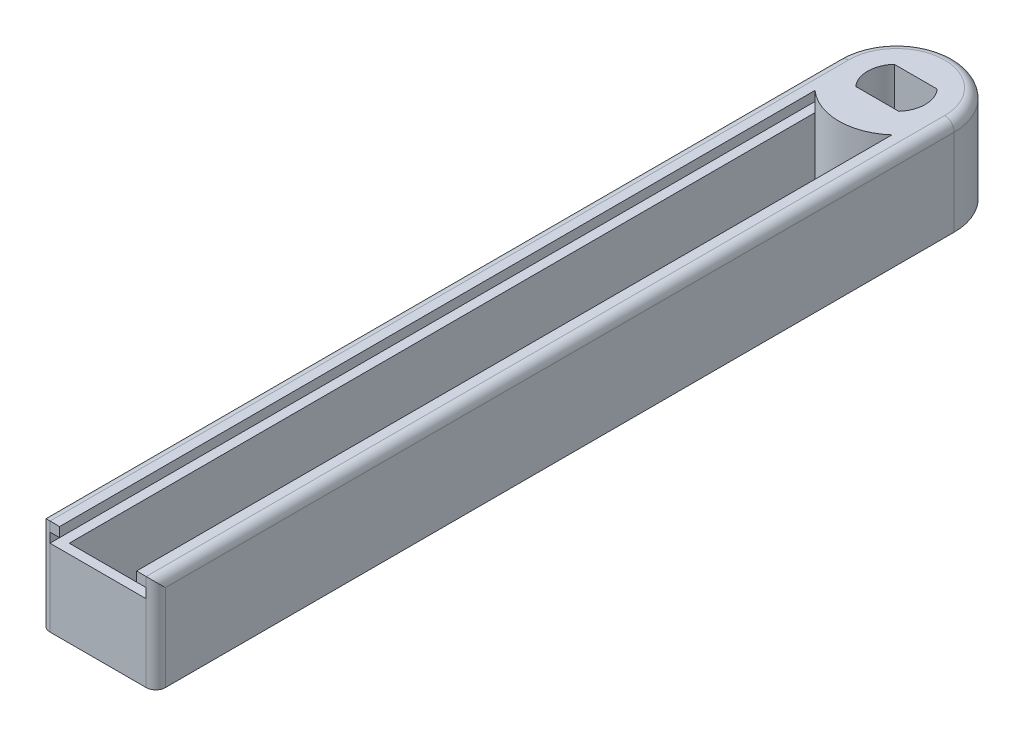
ISO-10303-21;
HEADER;
FILE_DESCRIPTION(('STEP AP214'),'2;1');
FILE_NAME('part.step','',(''),(''),'','','');
FILE_SCHEMA(('AUTOMOTIVE_DESIGN { 1 0 10303 214 1 1 1 1 }'));
ENDSEC;
DATA;
#1=APPLICATION_CONTEXT('core data for automotive mechanical design processes');
#2=APPLICATION_PROTOCOL_DEFINITION('international standard','automotive_design',2000,#1);
#3=PRODUCT_CONTEXT('',#1,'mechanical');
#4=PRODUCT('Part','Part','',(#3));
#5=PRODUCT_RELATED_PRODUCT_CATEGORY('part','',(#4));
#6=PRODUCT_DEFINITION_FORMATION('','',#4);
#7=PRODUCT_DEFINITION_CONTEXT('part definition',#1,'design');
#8=PRODUCT_DEFINITION('design','',#6,#7);
#9=PRODUCT_DEFINITION_SHAPE('','',#8);
#10=(LENGTH_UNIT() NAMED_UNIT(*) SI_UNIT(.MILLI.,.METRE.));
#11=(NAMED_UNIT(*) PLANE_ANGLE_UNIT() SI_UNIT($,.RADIAN.));
#12=(NAMED_UNIT(*) SI_UNIT($,.STERADIAN.) SOLID_ANGLE_UNIT());
#13=UNCERTAINTY_MEASURE_WITH_UNIT(LENGTH_MEASURE(1.E-05),#10,'distance_accuracy_value','');
#14=(GEOMETRIC_REPRESENTATION_CONTEXT(3) GLOBAL_UNCERTAINTY_ASSIGNED_CONTEXT((#13)) GLOBAL_UNIT_ASSIGNED_CONTEXT((#10,
#11,#12)) REPRESENTATION_CONTEXT('',''));
#15=CARTESIAN_POINT('',(0.,0.,0.));
#16=DIRECTION('',(0.,0.,1.));
#17=DIRECTION('',(1.,0.,0.));
#18=AXIS2_PLACEMENT_3D('',#15,#16,#17);
#19=CARTESIAN_POINT('',(0.,2.5,0.));
#20=DIRECTION('',(0.,-1.,0.));
#21=DIRECTION('',(0.,0.,-1.));
#22=AXIS2_PLACEMENT_3D('',#19,#20,#21);
#23=PLANE('',#22);
#24=CARTESIAN_POINT('',(-3.38181818181818,2.5,-6.94545454545455));
#25=DIRECTION('',(0.,-1.,0.));
#26=DIRECTION('',(0.,0.,-1.));
#27=AXIS2_PLACEMENT_3D('',#24,#25,#26);
#28=CIRCLE('',#27,3.);
#29=CARTESIAN_POINT('',(-5.61788615931797,2.5,-8.94545454545455));
#30=VERTEX_POINT('',#29);
#31=CARTESIAN_POINT('',(-1.14575020431839,2.5,-8.94545454545455));
#32=VERTEX_POINT('',#31);
#33=EDGE_CURVE('E246',#30,#32,#28,.T.);
#34=ORIENTED_EDGE('',*,*,#33,.T.);
#35=DIRECTION('',(1.,0.,0.));
#36=VECTOR('',#35,1.);
#37=CARTESIAN_POINT('',(0.,2.5,-8.94545454545455));
#38=LINE('',#37,#36);
#39=EDGE_CURVE('E238',#30,#32,#38,.T.);
#40=ORIENTED_EDGE('',*,*,#39,.F.);
#41=EDGE_LOOP('',(#34,#40));
#42=FACE_BOUND('',#41,.T.);
#43=ADVANCED_FACE('F44',(#42),#23,.T.);
#44=CARTESIAN_POINT('',(-3.38181818181818,10.,-6.94545454545455));
#45=DIRECTION('',(0.,-1.,0.));
#46=DIRECTION('',(0.,0.,-1.));
#47=AXIS2_PLACEMENT_3D('',#44,#45,#46);
#48=CYLINDRICAL_SURFACE('',#47,6.);
#49=DIRECTION('',(0.,1.,0.));
#50=VECTOR('',#49,1.);
#51=CARTESIAN_POINT('',(0.618181818181691,0.,-2.47331859045486));
#52=LINE('',#51,#50);
#53=CARTESIAN_POINT('',(0.618181818181691,0.,-2.47331859045486));
#54=VERTEX_POINT('',#53);
#55=CARTESIAN_POINT('',(0.618181818181828,8.,-2.47331859045498));
#56=VERTEX_POINT('',#55);
#57=EDGE_CURVE('E270',#54,#56,#52,.T.);
#58=ORIENTED_EDGE('',*,*,#57,.T.);
#59=CARTESIAN_POINT('',(-3.38181818181818,8.,-6.94545454545455));
#60=DIRECTION('',(0.,1.,0.));
#61=DIRECTION('',(0.,0.,1.));
#62=AXIS2_PLACEMENT_3D('',#59,#60,#61);
#63=CIRCLE('',#62,6.);
#64=CARTESIAN_POINT('',(1.49157899058629,8.,-3.44545454545454));
#65=VERTEX_POINT('',#64);
#66=EDGE_CURVE('E332',#56,#65,#63,.T.);
#67=ORIENTED_EDGE('',*,*,#66,.T.);
#68=DIRECTION('',(0.,-1.,0.));
#69=VECTOR('',#68,1.);
#70=CARTESIAN_POINT('',(1.49157899058629,10.,-3.44545454545454));
#71=LINE('',#70,#69);
#72=CARTESIAN_POINT('',(1.49157899058629,0.,-3.44545454545454));
#73=VERTEX_POINT('',#72);
#74=EDGE_CURVE('E463',#73,#65,#71,.F.);
#75=ORIENTED_EDGE('',*,*,#74,.F.);
#76=CARTESIAN_POINT('',(-3.38181818181818,0.,-6.94545454545455));
#77=DIRECTION('',(0.,1.,0.));
#78=DIRECTION('',(0.,0.,1.));
#79=AXIS2_PLACEMENT_3D('',#76,#77,#78);
#80=CIRCLE('',#79,6.);
#81=CARTESIAN_POINT('',(1.61818181818181,0.,-3.62882975509914));
#82=VERTEX_POINT('',#81);
#83=EDGE_CURVE('E391',#73,#82,#80,.T.);
#84=ORIENTED_EDGE('',*,*,#83,.T.);
#85=DIRECTION('',(0.,-1.,0.));
#86=VECTOR('',#85,1.);
#87=CARTESIAN_POINT('',(1.61818181818181,10.,-3.62882975509914));
#88=LINE('',#87,#86);
#89=CARTESIAN_POINT('',(1.61818181818183,9.,-3.62882975509914));
#90=VERTEX_POINT('',#89);
#91=EDGE_CURVE('E382',#90,#82,#88,.T.);
#92=ORIENTED_EDGE('',*,*,#91,.F.);
#93=CARTESIAN_POINT('',(-3.38181818181818,9.,-6.94545454545455));
#94=DIRECTION('',(0.,-1.,0.));
#95=DIRECTION('',(0.,0.,-1.));
#96=AXIS2_PLACEMENT_3D('',#93,#94,#95);
#97=CIRCLE('',#96,6.);
#98=CARTESIAN_POINT('',(0.618181818181824,9.,-2.47331859045498));
#99=VERTEX_POINT('',#98);
#100=EDGE_CURVE('E410',#90,#99,#97,.T.);
#101=ORIENTED_EDGE('',*,*,#100,.T.);
#102=DIRECTION('',(0.,1.,0.));
#103=VECTOR('',#102,1.);
#104=CARTESIAN_POINT('',(0.618181818181822,6.99999999999998,-2.47331859045498));
#105=LINE('',#104,#103);
#106=CARTESIAN_POINT('',(0.618181818181828,10.,-2.47331859045498));
#107=VERTEX_POINT('',#106);
#108=EDGE_CURVE('E296',#99,#107,#105,.T.);
#109=ORIENTED_EDGE('',*,*,#108,.T.);
#110=CARTESIAN_POINT('',(-3.38181818181818,10.,-6.94545454545455));
#111=DIRECTION('',(0.,1.,0.));
#112=DIRECTION('',(0.,0.,1.));
#113=AXIS2_PLACEMENT_3D('',#110,#111,#112);
#114=CIRCLE('',#113,6.);
#115=CARTESIAN_POINT('',(-7.38181818181817,10.,-2.47331859045496));
#116=VERTEX_POINT('',#115);
#117=EDGE_CURVE('E347',#116,#107,#114,.T.);
#118=ORIENTED_EDGE('',*,*,#117,.F.);
#119=DIRECTION('',(0.,1.,0.));
#120=VECTOR('',#119,1.);
#121=CARTESIAN_POINT('',(-7.38181818181817,6.99999999999999,-2.47331859045496));
#122=LINE('',#121,#120);
#123=CARTESIAN_POINT('',(-7.38181818181817,9.,-2.47331859045496));
#124=VERTEX_POINT('',#123);
#125=EDGE_CURVE('E292',#124,#116,#122,.T.);
#126=ORIENTED_EDGE('',*,*,#125,.F.);
#127=CARTESIAN_POINT('',(-3.38181818181818,9.,-6.94545454545455));
#128=DIRECTION('',(0.,-1.,0.));
#129=DIRECTION('',(0.,0.,-1.));
#130=AXIS2_PLACEMENT_3D('',#127,#128,#129);
#131=CIRCLE('',#130,6.);
#132=CARTESIAN_POINT('',(-8.38181818181817,9.,-3.62882975509914));
#133=VERTEX_POINT('',#132);
#134=EDGE_CURVE('E392',#124,#133,#131,.T.);
#135=ORIENTED_EDGE('',*,*,#134,.T.);
#136=DIRECTION('',(0.,-1.,0.));
#137=VECTOR('',#136,1.);
#138=CARTESIAN_POINT('',(-8.38181818181817,10.,-3.62882975509914));
#139=LINE('',#138,#137);
#140=CARTESIAN_POINT('',(-8.38181818181817,0.,-3.62882975509914));
#141=VERTEX_POINT('',#140);
#142=EDGE_CURVE('E387',#133,#141,#139,.T.);
#143=ORIENTED_EDGE('',*,*,#142,.T.);
#144=CARTESIAN_POINT('',(-8.25521535422266,0.,-3.44545454545454));
#145=VERTEX_POINT('',#144);
#146=EDGE_CURVE('E406',#141,#145,#80,.T.);
#147=ORIENTED_EDGE('',*,*,#146,.T.);
#148=DIRECTION('',(0.,-1.,0.));
#149=VECTOR('',#148,1.);
#150=CARTESIAN_POINT('',(-8.25521535422266,10.,-3.44545454545454));
#151=LINE('',#150,#149);
#152=CARTESIAN_POINT('',(-8.25521535422266,8.,-3.44545454545454));
#153=VERTEX_POINT('',#152);
#154=EDGE_CURVE('E430',#153,#145,#151,.T.);
#155=ORIENTED_EDGE('',*,*,#154,.F.);
#156=CARTESIAN_POINT('',(-3.38181818181818,8.,-6.94545454545455));
#157=DIRECTION('',(0.,1.,0.));
#158=DIRECTION('',(0.,0.,1.));
#159=AXIS2_PLACEMENT_3D('',#156,#157,#158);
#160=CIRCLE('',#159,6.);
#161=CARTESIAN_POINT('',(-7.38181818181817,8.,-2.47331859045496));
#162=VERTEX_POINT('',#161);
#163=EDGE_CURVE('E457',#153,#162,#160,.T.);
#164=ORIENTED_EDGE('',*,*,#163,.T.);
#165=DIRECTION('',(0.,1.,0.));
#166=VECTOR('',#165,1.);
#167=CARTESIAN_POINT('',(-7.38181818181817,0.,-2.47331859045496));
#168=LINE('',#167,#166);
#169=CARTESIAN_POINT('',(-7.38181818181817,0.,-2.47331859045496));
#170=VERTEX_POINT('',#169);
#171=EDGE_CURVE('E285',#170,#162,#168,.T.);
#172=ORIENTED_EDGE('',*,*,#171,.F.);
#173=EDGE_CURVE('E411',#170,#54,#80,.T.);
#174=ORIENTED_EDGE('',*,*,#173,.T.);
#175=EDGE_LOOP('',(#58,#67,#75,#84,#92,#101,#109,#118,#126,#135,#143,#147,#155,#164,#172,#174));
#176=FACE_BOUND('',#175,.T.);
#177=ADVANCED_FACE('F570',(#176),#48,.T.);
#178=CARTESIAN_POINT('',(0.,10.,75.0545454545455));
#179=DIRECTION('',(0.,0.,-1.));
#180=DIRECTION('',(-1.,0.,0.));
#181=AXIS2_PLACEMENT_3D('',#178,#179,#180);
#182=PLANE('',#181);
#183=DIRECTION('',(1.,0.,0.));
#184=VECTOR('',#183,1.);
#185=CARTESIAN_POINT('',(0.,8.,75.0545454545455));
#186=LINE('',#185,#184);
#187=CARTESIAN_POINT('',(-7.38181818181817,8.,75.0545454545455));
#188=VERTEX_POINT('',#187);
#189=CARTESIAN_POINT('',(0.618181818181827,8.,75.0545454545455));
#190=VERTEX_POINT('',#189);
#191=EDGE_CURVE('E386',#188,#190,#186,.T.);
#192=ORIENTED_EDGE('',*,*,#191,.T.);
#193=DIRECTION('',(0.,-1.,0.));
#194=VECTOR('',#193,1.);
#195=CARTESIAN_POINT('',(0.618181818181826,10.,75.0545454545455));
#196=LINE('',#195,#194);
#197=CARTESIAN_POINT('',(0.618181818181826,0.,75.0545454545455));
#198=VERTEX_POINT('',#197);
#199=EDGE_CURVE('E273',#190,#198,#196,.T.);
#200=ORIENTED_EDGE('',*,*,#199,.T.);
#201=DIRECTION('',(1.,0.,0.));
#202=VECTOR('',#201,1.);
#203=CARTESIAN_POINT('',(0.,0.,75.0545454545455));
#204=LINE('',#203,#202);
#205=CARTESIAN_POINT('',(-7.38181818181817,0.,75.0545454545455));
#206=VERTEX_POINT('',#205);
#207=EDGE_CURVE('E328',#206,#198,#204,.T.);
#208=ORIENTED_EDGE('',*,*,#207,.F.);
#209=DIRECTION('',(0.,-1.,0.));
#210=VECTOR('',#209,1.);
#211=CARTESIAN_POINT('',(-7.38181818181817,10.,75.0545454545455));
#212=LINE('',#211,#210);
#213=EDGE_CURVE('E288',#188,#206,#212,.T.);
#214=ORIENTED_EDGE('',*,*,#213,.F.);
#215=EDGE_LOOP('',(#192,#200,#208,#214));
#216=FACE_BOUND('',#215,.T.);
#217=ADVANCED_FACE('F580',(#216),#182,.T.);
#218=CARTESIAN_POINT('',(0.,10.,76.0545454545455));
#219=DIRECTION('',(0.,0.,-1.));
#220=DIRECTION('',(-1.,0.,0.));
#221=AXIS2_PLACEMENT_3D('',#218,#219,#220);
#222=PLANE('',#221);
#223=DIRECTION('',(0.,-1.,0.));
#224=VECTOR('',#223,1.);
#225=CARTESIAN_POINT('',(0.61818181818181,0.,76.0545454545455));
#226=LINE('',#225,#224);
#227=CARTESIAN_POINT('',(0.618181818181828,10.,76.0545454545455));
#228=VERTEX_POINT('',#227);
#229=CARTESIAN_POINT('',(0.618181818181826,9.,76.0545454545455));
#230=VERTEX_POINT('',#229);
#231=EDGE_CURVE('E300',#228,#230,#226,.T.);
#232=ORIENTED_EDGE('',*,*,#231,.T.);
#233=DIRECTION('',(1.,0.,0.));
#234=VECTOR('',#233,1.);
#235=CARTESIAN_POINT('',(0.,9.,76.0545454545455));
#236=LINE('',#235,#234);
#237=CARTESIAN_POINT('',(1.61818181818183,9.,76.0545454545455));
#238=VERTEX_POINT('',#237);
#239=EDGE_CURVE('E348',#230,#238,#236,.T.);
#240=ORIENTED_EDGE('',*,*,#239,.T.);
#241=DIRECTION('',(0.,-1.,0.));
#242=VECTOR('',#241,1.);
#243=CARTESIAN_POINT('',(1.61818181818183,10.,76.0545454545455));
#244=LINE('',#243,#242);
#245=CARTESIAN_POINT('',(1.61818181818183,10.,76.0545454545455));
#246=VERTEX_POINT('',#245);
#247=EDGE_CURVE('E343',#238,#246,#244,.F.);
#248=ORIENTED_EDGE('',*,*,#247,.T.);
#249=DIRECTION('',(1.,0.,0.));
#250=VECTOR('',#249,1.);
#251=CARTESIAN_POINT('',(0.,10.,76.0545454545455));
#252=LINE('',#251,#250);
#253=EDGE_CURVE('E370',#228,#246,#252,.T.);
#254=ORIENTED_EDGE('',*,*,#253,.F.);
#255=EDGE_LOOP('',(#232,#240,#248,#254));
#256=FACE_BOUND('',#255,.T.);
#257=ADVANCED_FACE('F508',(#256),#222,.F.);
#258=CARTESIAN_POINT('',(0.,10.,0.));
#259=DIRECTION('',(0.,1.,0.));
#260=DIRECTION('',(0.,0.,1.));
#261=AXIS2_PLACEMENT_3D('',#258,#259,#260);
#262=PLANE('',#261);
#263=DIRECTION('',(1.,0.,0.));
#264=VECTOR('',#263,1.);
#265=CARTESIAN_POINT('',(0.,10.,-4.94545454545455));
#266=LINE('',#265,#264);
#267=CARTESIAN_POINT('',(-5.61788615931797,10.,-4.94545454545455));
#268=VERTEX_POINT('',#267);
#269=CARTESIAN_POINT('',(-1.14575020431839,10.,-4.94545454545455));
#270=VERTEX_POINT('',#269);
#271=EDGE_CURVE('E62',#268,#270,#266,.T.);
#272=ORIENTED_EDGE('',*,*,#271,.F.);
#273=CARTESIAN_POINT('',(-3.38181818181818,10.,-6.94545454545455));
#274=DIRECTION('',(0.,1.,0.));
#275=DIRECTION('',(0.,0.,1.));
#276=AXIS2_PLACEMENT_3D('',#273,#274,#275);
#277=CIRCLE('',#276,3.);
#278=CARTESIAN_POINT('',(-5.61788615931797,10.,-8.94545454545455));
#279=VERTEX_POINT('',#278);
#280=EDGE_CURVE('E231',#279,#268,#277,.T.);
#281=ORIENTED_EDGE('',*,*,#280,.F.);
#282=DIRECTION('',(1.,0.,0.));
#283=VECTOR('',#282,1.);
#284=CARTESIAN_POINT('',(0.,10.,-8.94545454545455));
#285=LINE('',#284,#283);
#286=CARTESIAN_POINT('',(-1.14575020431839,10.,-8.94545454545455));
#287=VERTEX_POINT('',#286);
#288=EDGE_CURVE('E1151',#279,#287,#285,.T.);
#289=ORIENTED_EDGE('',*,*,#288,.T.);
#290=EDGE_CURVE('E1153',#270,#287,#277,.T.);
#291=ORIENTED_EDGE('',*,*,#290,.F.);
#292=EDGE_LOOP('',(#272,#281,#289,#291));
#293=FACE_BOUND('',#292,.T.);
#294=ORIENTED_EDGE('',*,*,#117,.T.);
#295=DIRECTION('',(0.,0.,1.));
#296=VECTOR('',#295,1.);
#297=CARTESIAN_POINT('',(0.618181818181828,10.,-2.94545454545456));
#298=LINE('',#297,#296);
#299=EDGE_CURVE('E425',#107,#228,#298,.T.);
#300=ORIENTED_EDGE('',*,*,#299,.T.);
#301=ORIENTED_EDGE('',*,*,#253,.T.);
#302=DIRECTION('',(0.,0.,1.));
#303=VECTOR('',#302,1.);
#304=CARTESIAN_POINT('',(1.61818181818182,10.,0.));
#305=LINE('',#304,#303);
#306=CARTESIAN_POINT('',(1.61818181818182,10.,-6.94545454545455));
#307=VERTEX_POINT('',#306);
#308=EDGE_CURVE('E366',#246,#307,#305,.F.);
#309=ORIENTED_EDGE('',*,*,#308,.T.);
#310=CARTESIAN_POINT('',(-3.38181818181818,10.,-6.94545454545455));
#311=DIRECTION('',(0.,1.,0.));
#312=DIRECTION('',(0.,0.,1.));
#313=AXIS2_PLACEMENT_3D('',#310,#311,#312);
#314=CIRCLE('',#313,5.);
#315=CARTESIAN_POINT('',(-8.38181818181818,10.,-6.94545454545455));
#316=VERTEX_POINT('',#315);
#317=EDGE_CURVE('E369',#307,#316,#314,.T.);
#318=ORIENTED_EDGE('',*,*,#317,.T.);
#319=DIRECTION('',(0.,0.,1.));
#320=VECTOR('',#319,1.);
#321=CARTESIAN_POINT('',(-8.38181818181817,10.,76.0545454545455));
#322=LINE('',#321,#320);
#323=CARTESIAN_POINT('',(-8.38181818181817,10.,76.0545454545455));
#324=VERTEX_POINT('',#323);
#325=EDGE_CURVE('E371',#316,#324,#322,.T.);
#326=ORIENTED_EDGE('',*,*,#325,.T.);
#327=CARTESIAN_POINT('',(-7.38181818181817,10.,76.0545454545455));
#328=VERTEX_POINT('',#327);
#329=EDGE_CURVE('E374',#324,#328,#252,.T.);
#330=ORIENTED_EDGE('',*,*,#329,.T.);
#331=DIRECTION('',(0.,0.,1.));
#332=VECTOR('',#331,1.);
#333=CARTESIAN_POINT('',(-7.38181818181817,10.,-2.94545454545456));
#334=LINE('',#333,#332);
#335=EDGE_CURVE('E11',#116,#328,#334,.T.);
#336=ORIENTED_EDGE('',*,*,#335,.F.);
#337=EDGE_LOOP('',(#294,#300,#301,#309,#318,#326,#330,#336));
#338=FACE_BOUND('',#337,.T.);
#339=ADVANCED_FACE('F500',(#293,#338),#262,.T.);
#340=CARTESIAN_POINT('',(0.,9.,-12.9464545454546));
#341=DIRECTION('',(0.,-1.,0.));
#342=DIRECTION('',(0.,0.,-1.));
#343=AXIS2_PLACEMENT_3D('',#340,#341,#342);
#344=PLANE('',#343);
#345=ORIENTED_EDGE('',*,*,#239,.F.);
#346=DIRECTION('',(0.,0.,1.));
#347=VECTOR('',#346,1.);
#348=CARTESIAN_POINT('',(0.618181818181826,9.,-2.94545454545456));
#349=LINE('',#348,#347);
#350=EDGE_CURVE('E318',#99,#230,#349,.T.);
#351=ORIENTED_EDGE('',*,*,#350,.F.);
#352=ORIENTED_EDGE('',*,*,#100,.F.);
#353=DIRECTION('',(0.,0.,1.));
#354=VECTOR('',#353,1.);
#355=CARTESIAN_POINT('',(1.61818181818183,9.,-12.9464545454546));
#356=LINE('',#355,#354);
#357=EDGE_CURVE('E435',#90,#238,#356,.T.);
#358=ORIENTED_EDGE('',*,*,#357,.T.);
#359=EDGE_LOOP('',(#345,#351,#352,#358));
#360=FACE_BOUND('',#359,.T.);
#361=ADVANCED_FACE('F612',(#360),#344,.T.);
#362=CARTESIAN_POINT('',(-8.38181818181817,9.,76.0545454545455));
#363=VERTEX_POINT('',#362);
#364=CARTESIAN_POINT('',(-7.38181818181817,9.,76.0545454545455));
#365=VERTEX_POINT('',#364);
#366=EDGE_CURVE('E48',#363,#365,#236,.T.);
#367=ORIENTED_EDGE('',*,*,#366,.T.);
#368=DIRECTION('',(0.,-1.,0.));
#369=VECTOR('',#368,1.);
#370=CARTESIAN_POINT('',(-7.38181818181817,0.,76.0545454545455));
#371=LINE('',#370,#369);
#372=EDGE_CURVE('E54',#328,#365,#371,.T.);
#373=ORIENTED_EDGE('',*,*,#372,.F.);
#374=ORIENTED_EDGE('',*,*,#329,.F.);
#375=DIRECTION('',(0.,-1.,0.));
#376=VECTOR('',#375,1.);
#377=CARTESIAN_POINT('',(-8.38181818181817,10.,76.0545454545455));
#378=LINE('',#377,#376);
#379=EDGE_CURVE('E329',#324,#363,#378,.T.);
#380=ORIENTED_EDGE('',*,*,#379,.T.);
#381=EDGE_LOOP('',(#367,#373,#374,#380));
#382=FACE_BOUND('',#381,.T.);
#383=ADVANCED_FACE('F528',(#382),#222,.F.);
#384=CARTESIAN_POINT('',(1.61818181818181,10.,0.));
#385=DIRECTION('',(-1.,0.,0.));
#386=DIRECTION('',(0.,0.,1.));
#387=AXIS2_PLACEMENT_3D('',#384,#385,#386);
#388=PLANE('',#387);
#389=DIRECTION('',(0.,0.,-1.));
#390=VECTOR('',#389,1.);
#391=CARTESIAN_POINT('',(1.61818181818181,0.,0.));
#392=LINE('',#391,#390);
#393=CARTESIAN_POINT('',(1.61818181818181,0.,-3.44545454545454));
#394=VERTEX_POINT('',#393);
#395=EDGE_CURVE('E401',#394,#82,#392,.T.);
#396=ORIENTED_EDGE('',*,*,#395,.F.);
#397=DIRECTION('',(0.,-1.,0.));
#398=VECTOR('',#397,1.);
#399=CARTESIAN_POINT('',(1.61818181818183,0.,-3.44545454545454));
#400=LINE('',#399,#398);
#401=CARTESIAN_POINT('',(1.61818181818181,8.,-3.44545454545454));
#402=VERTEX_POINT('',#401);
#403=EDGE_CURVE('E451',#402,#394,#400,.T.);
#404=ORIENTED_EDGE('',*,*,#403,.F.);
#405=DIRECTION('',(0.,0.,1.));
#406=VECTOR('',#405,1.);
#407=CARTESIAN_POINT('',(1.61818181818183,8.,-12.9464545454546));
#408=LINE('',#407,#406);
#409=CARTESIAN_POINT('',(1.61818181818183,8.,76.0545454545455));
#410=VERTEX_POINT('',#409);
#411=EDGE_CURVE('E337',#402,#410,#408,.T.);
#412=ORIENTED_EDGE('',*,*,#411,.T.);
#413=DIRECTION('',(0.,-1.,0.));
#414=VECTOR('',#413,1.);
#415=CARTESIAN_POINT('',(1.61818181818183,0.,76.0545454545455));
#416=LINE('',#415,#414);
#417=EDGE_CURVE('E306',#238,#410,#416,.T.);
#418=ORIENTED_EDGE('',*,*,#417,.F.);
#419=ORIENTED_EDGE('',*,*,#357,.F.);
#420=ORIENTED_EDGE('',*,*,#91,.T.);
#421=EDGE_LOOP('',(#396,#404,#412,#418,#419,#420));
#422=FACE_BOUND('',#421,.T.);
#423=ADVANCED_FACE('F558',(#422),#388,.T.);
#424=DIRECTION('',(0.,-1.,0.));
#425=VECTOR('',#424,1.);
#426=CARTESIAN_POINT('',(1.61818181818183,10.,76.0545454545455));
#427=LINE('',#426,#425);
#428=CARTESIAN_POINT('',(1.61818181818183,0.,76.0545454545455));
#429=VERTEX_POINT('',#428);
#430=EDGE_CURVE('E338',#429,#410,#427,.F.);
#431=ORIENTED_EDGE('',*,*,#430,.T.);
#432=DIRECTION('',(1.,0.,0.));
#433=VECTOR('',#432,1.);
#434=CARTESIAN_POINT('',(0.,8.,76.0545454545455));
#435=LINE('',#434,#433);
#436=CARTESIAN_POINT('',(-8.38181818181817,8.,76.0545454545455));
#437=VERTEX_POINT('',#436);
#438=EDGE_CURVE('E444',#437,#410,#435,.T.);
#439=ORIENTED_EDGE('',*,*,#438,.F.);
#440=DIRECTION('',(0.,-1.,0.));
#441=VECTOR('',#440,1.);
#442=CARTESIAN_POINT('',(-8.38181818181817,10.,76.0545454545455));
#443=LINE('',#442,#441);
#444=CARTESIAN_POINT('',(-8.38181818181817,0.,76.0545454545455));
#445=VERTEX_POINT('',#444);
#446=EDGE_CURVE('E333',#437,#445,#443,.T.);
#447=ORIENTED_EDGE('',*,*,#446,.T.);
#448=DIRECTION('',(1.,0.,0.));
#449=VECTOR('',#448,1.);
#450=CARTESIAN_POINT('',(0.,0.,76.0545454545455));
#451=LINE('',#450,#449);
#452=EDGE_CURVE('E336',#445,#429,#451,.T.);
#453=ORIENTED_EDGE('',*,*,#452,.T.);
#454=EDGE_LOOP('',(#431,#439,#447,#453));
#455=FACE_BOUND('',#454,.T.);
#456=ADVANCED_FACE('F46',(#455),#222,.F.);
#457=CARTESIAN_POINT('',(2.61818181818182,10.,0.));
#458=DIRECTION('',(1.,0.,0.));
#459=DIRECTION('',(0.,0.,-1.));
#460=AXIS2_PLACEMENT_3D('',#457,#458,#459);
#461=PLANE('',#460);
#462=DIRECTION('',(0.,-1.,0.));
#463=VECTOR('',#462,1.);
#464=CARTESIAN_POINT('',(2.61818181818182,10.,-6.94545454545455));
#465=LINE('',#464,#463);
#466=CARTESIAN_POINT('',(2.61818181818182,9.,-6.94545454545455));
#467=VERTEX_POINT('',#466);
#468=CARTESIAN_POINT('',(2.61818181818182,0.,-6.94545454545455));
#469=VERTEX_POINT('',#468);
#470=EDGE_CURVE('E357',#467,#469,#465,.T.);
#471=ORIENTED_EDGE('',*,*,#470,.F.);
#472=DIRECTION('',(0.,0.,1.));
#473=VECTOR('',#472,1.);
#474=CARTESIAN_POINT('',(2.61818181818182,9.,0.));
#475=LINE('',#474,#473);
#476=CARTESIAN_POINT('',(2.61818181818183,9.,75.0545454545455));
#477=VERTEX_POINT('',#476);
#478=EDGE_CURVE('E342',#467,#477,#475,.T.);
#479=ORIENTED_EDGE('',*,*,#478,.T.);
#480=DIRECTION('',(0.,-1.,0.));
#481=VECTOR('',#480,1.);
#482=CARTESIAN_POINT('',(2.61818181818183,0.,75.0545454545455));
#483=LINE('',#482,#481);
#484=CARTESIAN_POINT('',(2.61818181818183,0.,75.0545454545455));
#485=VERTEX_POINT('',#484);
#486=EDGE_CURVE('E351',#477,#485,#483,.T.);
#487=ORIENTED_EDGE('',*,*,#486,.T.);
#488=DIRECTION('',(0.,0.,1.));
#489=VECTOR('',#488,1.);
#490=CARTESIAN_POINT('',(2.61818181818182,0.,0.));
#491=LINE('',#490,#489);
#492=EDGE_CURVE('E322',#469,#485,#491,.T.);
#493=ORIENTED_EDGE('',*,*,#492,.F.);
#494=EDGE_LOOP('',(#471,#479,#487,#493));
#495=FACE_BOUND('',#494,.T.);
#496=ADVANCED_FACE('F655',(#495),#461,.T.);
#497=CARTESIAN_POINT('',(-3.38181818181818,10.,-6.94545454545455));
#498=DIRECTION('',(0.,-1.,0.));
#499=DIRECTION('',(0.,0.,-1.));
#500=AXIS2_PLACEMENT_3D('',#497,#498,#499);
#501=CYLINDRICAL_SURFACE('',#500,6.);
#502=DIRECTION('',(0.,-1.,0.));
#503=VECTOR('',#502,1.);
#504=CARTESIAN_POINT('',(-9.38181818181818,10.,-6.94545454545455));
#505=LINE('',#504,#503);
#506=CARTESIAN_POINT('',(-9.38181818181818,9.,-6.94545454545455));
#507=VERTEX_POINT('',#506);
#508=CARTESIAN_POINT('',(-9.38181818181818,0.,-6.94545454545455));
#509=VERTEX_POINT('',#508);
#510=EDGE_CURVE('E361',#507,#509,#505,.T.);
#511=ORIENTED_EDGE('',*,*,#510,.F.);
#512=CARTESIAN_POINT('',(-3.38181818181818,9.,-6.94545454545455));
#513=DIRECTION('',(0.,1.,0.));
#514=DIRECTION('',(0.,0.,1.));
#515=AXIS2_PLACEMENT_3D('',#512,#513,#514);
#516=CIRCLE('',#515,6.);
#517=EDGE_CURVE('E354',#507,#467,#516,.F.);
#518=ORIENTED_EDGE('',*,*,#517,.T.);
#519=ORIENTED_EDGE('',*,*,#470,.T.);
#520=CARTESIAN_POINT('',(-3.38181818181818,0.,-6.94545454545455));
#521=DIRECTION('',(0.,1.,0.));
#522=DIRECTION('',(0.,0.,1.));
#523=AXIS2_PLACEMENT_3D('',#520,#521,#522);
#524=CIRCLE('',#523,6.);
#525=EDGE_CURVE('E365',#469,#509,#524,.T.);
#526=ORIENTED_EDGE('',*,*,#525,.T.);
#527=EDGE_LOOP('',(#511,#518,#519,#526));
#528=FACE_BOUND('',#527,.T.);
#529=ADVANCED_FACE('F541',(#528),#501,.T.);
#530=CARTESIAN_POINT('',(-9.38181818181818,10.,0.));
#531=DIRECTION('',(1.,0.,0.));
#532=DIRECTION('',(0.,0.,-1.));
#533=AXIS2_PLACEMENT_3D('',#530,#531,#532);
#534=PLANE('',#533);
#535=DIRECTION('',(0.,-1.,0.));
#536=VECTOR('',#535,1.);
#537=CARTESIAN_POINT('',(-9.38181818181817,10.,75.0545454545455));
#538=LINE('',#537,#536);
#539=CARTESIAN_POINT('',(-9.38181818181817,0.,75.0545454545455));
#540=VERTEX_POINT('',#539);
#541=CARTESIAN_POINT('',(-9.38181818181817,9.,75.0545454545455));
#542=VERTEX_POINT('',#541);
#543=EDGE_CURVE('E362',#540,#542,#538,.F.);
#544=ORIENTED_EDGE('',*,*,#543,.T.);
#545=DIRECTION('',(0.,0.,1.));
#546=VECTOR('',#545,1.);
#547=CARTESIAN_POINT('',(-9.38181818181818,9.,-6.94545454545455));
#548=LINE('',#547,#546);
#549=EDGE_CURVE('E358',#542,#507,#548,.F.);
#550=ORIENTED_EDGE('',*,*,#549,.T.);
#551=ORIENTED_EDGE('',*,*,#510,.T.);
#552=DIRECTION('',(0.,0.,1.));
#553=VECTOR('',#552,1.);
#554=CARTESIAN_POINT('',(-9.38181818181818,0.,0.));
#555=LINE('',#554,#553);
#556=EDGE_CURVE('E381',#509,#540,#555,.T.);
#557=ORIENTED_EDGE('',*,*,#556,.T.);
#558=EDGE_LOOP('',(#544,#550,#551,#557));
#559=FACE_BOUND('',#558,.T.);
#560=ADVANCED_FACE('F539',(#559),#534,.F.);
#561=CARTESIAN_POINT('',(-8.38181818181817,10.,0.));
#562=DIRECTION('',(-1.,0.,0.));
#563=DIRECTION('',(0.,0.,1.));
#564=AXIS2_PLACEMENT_3D('',#561,#562,#563);
#565=PLANE('',#564);
#566=DIRECTION('',(0.,-1.,0.));
#567=VECTOR('',#566,1.);
#568=CARTESIAN_POINT('',(-8.38181818181817,0.,-3.44545454545454));
#569=LINE('',#568,#567);
#570=CARTESIAN_POINT('',(-8.38181818181817,8.,-3.44545454545454));
#571=VERTEX_POINT('',#570);
#572=CARTESIAN_POINT('',(-8.38181818181817,0.,-3.44545454545454));
#573=VERTEX_POINT('',#572);
#574=EDGE_CURVE('E397',#571,#573,#569,.T.);
#575=ORIENTED_EDGE('',*,*,#574,.T.);
#576=DIRECTION('',(0.,0.,-1.));
#577=VECTOR('',#576,1.);
#578=CARTESIAN_POINT('',(-8.38181818181817,0.,0.));
#579=LINE('',#578,#577);
#580=EDGE_CURVE('E393',#573,#141,#579,.T.);
#581=ORIENTED_EDGE('',*,*,#580,.T.);
#582=ORIENTED_EDGE('',*,*,#142,.F.);
#583=DIRECTION('',(0.,0.,1.));
#584=VECTOR('',#583,1.);
#585=CARTESIAN_POINT('',(-8.38181818181817,9.,-12.9464545454546));
#586=LINE('',#585,#584);
#587=EDGE_CURVE('E396',#133,#363,#586,.T.);
#588=ORIENTED_EDGE('',*,*,#587,.T.);
#589=DIRECTION('',(0.,-1.,0.));
#590=VECTOR('',#589,1.);
#591=CARTESIAN_POINT('',(-8.38181818181817,0.,76.0545454545455));
#592=LINE('',#591,#590);
#593=EDGE_CURVE('E323',#363,#437,#592,.T.);
#594=ORIENTED_EDGE('',*,*,#593,.T.);
#595=DIRECTION('',(0.,0.,1.));
#596=VECTOR('',#595,1.);
#597=CARTESIAN_POINT('',(-8.38181818181817,8.,-12.9464545454546));
#598=LINE('',#597,#596);
#599=EDGE_CURVE('E426',#571,#437,#598,.T.);
#600=ORIENTED_EDGE('',*,*,#599,.F.);
#601=EDGE_LOOP('',(#575,#581,#582,#588,#594,#600));
#602=FACE_BOUND('',#601,.T.);
#603=ADVANCED_FACE('F594',(#602),#565,.F.);
#604=CARTESIAN_POINT('',(0.,0.,0.));
#605=DIRECTION('',(0.,1.,0.));
#606=DIRECTION('',(0.,0.,1.));
#607=AXIS2_PLACEMENT_3D('',#604,#605,#606);
#608=PLANE('',#607);
#609=CARTESIAN_POINT('',(-3.38181818181818,0.,-6.94545454545455));
#610=DIRECTION('',(0.,-1.,0.));
#611=DIRECTION('',(0.,0.,-1.));
#612=AXIS2_PLACEMENT_3D('',#609,#610,#611);
#613=CIRCLE('',#612,3.);
#614=CARTESIAN_POINT('',(-3.38181818181818,0.,-9.94545454545455));
#615=VERTEX_POINT('',#614);
#616=EDGE_CURVE('E254',#615,#615,#613,.T.);
#617=ORIENTED_EDGE('',*,*,#616,.F.);
#618=EDGE_LOOP('',(#617));
#619=FACE_BOUND('',#618,.T.);
#620=ORIENTED_EDGE('',*,*,#207,.T.);
#621=DIRECTION('',(0.,0.,-1.));
#622=VECTOR('',#621,1.);
#623=CARTESIAN_POINT('',(0.618181818181695,0.,0.));
#624=LINE('',#623,#622);
#625=EDGE_CURVE('E262',#198,#54,#624,.T.);
#626=ORIENTED_EDGE('',*,*,#625,.T.);
#627=ORIENTED_EDGE('',*,*,#173,.F.);
#628=DIRECTION('',(0.,0.,-1.));
#629=VECTOR('',#628,1.);
#630=CARTESIAN_POINT('',(-7.38181818181817,0.,0.));
#631=LINE('',#630,#629);
#632=EDGE_CURVE('E277',#206,#170,#631,.T.);
#633=ORIENTED_EDGE('',*,*,#632,.F.);
#634=EDGE_LOOP('',(#620,#626,#627,#633));
#635=FACE_BOUND('',#634,.T.);
#636=CARTESIAN_POINT('',(1.61818181818183,0.,75.0545454545455));
#637=DIRECTION('',(0.,1.,0.));
#638=DIRECTION('',(0.,0.,1.));
#639=AXIS2_PLACEMENT_3D('',#636,#637,#638);
#640=CIRCLE('',#639,1.);
#641=EDGE_CURVE('E324',#485,#429,#640,.F.);
#642=ORIENTED_EDGE('',*,*,#641,.T.);
#643=ORIENTED_EDGE('',*,*,#452,.F.);
#644=CARTESIAN_POINT('',(-8.38181818181817,0.,75.0545454545455));
#645=DIRECTION('',(0.,1.,0.));
#646=DIRECTION('',(0.,0.,1.));
#647=AXIS2_PLACEMENT_3D('',#644,#645,#646);
#648=CIRCLE('',#647,1.);
#649=EDGE_CURVE('E319',#445,#540,#648,.F.);
#650=ORIENTED_EDGE('',*,*,#649,.T.);
#651=ORIENTED_EDGE('',*,*,#556,.F.);
#652=ORIENTED_EDGE('',*,*,#525,.F.);
#653=ORIENTED_EDGE('',*,*,#492,.T.);
#654=EDGE_LOOP('',(#642,#643,#650,#651,#652,#653));
#655=FACE_BOUND('',#654,.T.);
#656=ORIENTED_EDGE('',*,*,#83,.F.);
#657=DIRECTION('',(-1.,0.,0.));
#658=VECTOR('',#657,1.);
#659=CARTESIAN_POINT('',(0.,0.,-3.44545454545454));
#660=LINE('',#659,#658);
#661=EDGE_CURVE('E266',#394,#73,#660,.T.);
#662=ORIENTED_EDGE('',*,*,#661,.F.);
#663=ORIENTED_EDGE('',*,*,#395,.T.);
#664=EDGE_LOOP('',(#656,#662,#663));
#665=FACE_BOUND('',#664,.T.);
#666=ORIENTED_EDGE('',*,*,#580,.F.);
#667=DIRECTION('',(-1.,0.,0.));
#668=VECTOR('',#667,1.);
#669=CARTESIAN_POINT('',(0.,0.,-3.44545454545454));
#670=LINE('',#669,#668);
#671=EDGE_CURVE('E281',#145,#573,#670,.T.);
#672=ORIENTED_EDGE('',*,*,#671,.F.);
#673=ORIENTED_EDGE('',*,*,#146,.F.);
#674=EDGE_LOOP('',(#666,#672,#673));
#675=FACE_BOUND('',#674,.T.);
#676=ADVANCED_FACE('F547',(#619,#635,#655,#665,#675),#608,.F.);
#677=DIRECTION('',(1.,0.,0.));
#678=VECTOR('',#677,1.);
#679=CARTESIAN_POINT('',(0.,2.5,-4.94545454545455));
#680=LINE('',#679,#678);
#681=CARTESIAN_POINT('',(-5.61788615931797,2.5,-4.94545454545455));
#682=VERTEX_POINT('',#681);
#683=CARTESIAN_POINT('',(-1.14575020431839,2.5,-4.94545454545455));
#684=VERTEX_POINT('',#683);
#685=EDGE_CURVE('E226',#682,#684,#680,.T.);
#686=ORIENTED_EDGE('',*,*,#685,.T.);
#687=EDGE_CURVE('E236',#684,#682,#28,.T.);
#688=ORIENTED_EDGE('',*,*,#687,.T.);
#689=EDGE_LOOP('',(#686,#688));
#690=FACE_BOUND('',#689,.T.);
#691=ADVANCED_FACE('F235',(#690),#23,.T.);
#692=DIRECTION('',(0.,0.,1.));
#693=VECTOR('',#692,1.);
#694=CARTESIAN_POINT('',(-7.38181818181817,9.,-2.94545454545456));
#695=LINE('',#694,#693);
#696=EDGE_CURVE('E405',#124,#365,#695,.T.);
#697=ORIENTED_EDGE('',*,*,#696,.T.);
#698=ORIENTED_EDGE('',*,*,#366,.F.);
#699=ORIENTED_EDGE('',*,*,#587,.F.);
#700=ORIENTED_EDGE('',*,*,#134,.F.);
#701=EDGE_LOOP('',(#697,#698,#699,#700));
#702=FACE_BOUND('',#701,.T.);
#703=ADVANCED_FACE('F600',(#702),#344,.T.);
#704=CARTESIAN_POINT('',(0.,8.,-12.9464545454546));
#705=DIRECTION('',(0.,-1.,0.));
#706=DIRECTION('',(0.,0.,-1.));
#707=AXIS2_PLACEMENT_3D('',#704,#705,#706);
#708=PLANE('',#707);
#709=DIRECTION('',(0.,0.,-1.));
#710=VECTOR('',#709,1.);
#711=CARTESIAN_POINT('',(0.618181818181828,8.,0.));
#712=LINE('',#711,#710);
#713=EDGE_CURVE('E251',#190,#56,#712,.T.);
#714=ORIENTED_EDGE('',*,*,#713,.F.);
#715=ORIENTED_EDGE('',*,*,#191,.F.);
#716=DIRECTION('',(0.,0.,1.));
#717=VECTOR('',#716,1.);
#718=CARTESIAN_POINT('',(-7.38181818181817,8.,0.));
#719=LINE('',#718,#717);
#720=EDGE_CURVE('E245',#162,#188,#719,.T.);
#721=ORIENTED_EDGE('',*,*,#720,.F.);
#722=ORIENTED_EDGE('',*,*,#163,.F.);
#723=DIRECTION('',(-1.,0.,0.));
#724=VECTOR('',#723,1.);
#725=CARTESIAN_POINT('',(0.,8.,-3.44545454545454));
#726=LINE('',#725,#724);
#727=EDGE_CURVE('E431',#153,#571,#726,.T.);
#728=ORIENTED_EDGE('',*,*,#727,.T.);
#729=ORIENTED_EDGE('',*,*,#599,.T.);
#730=ORIENTED_EDGE('',*,*,#438,.T.);
#731=ORIENTED_EDGE('',*,*,#411,.F.);
#732=DIRECTION('',(-1.,0.,0.));
#733=VECTOR('',#732,1.);
#734=CARTESIAN_POINT('',(0.,8.,-3.44545454545454));
#735=LINE('',#734,#733);
#736=EDGE_CURVE('E447',#402,#65,#735,.T.);
#737=ORIENTED_EDGE('',*,*,#736,.T.);
#738=ORIENTED_EDGE('',*,*,#66,.F.);
#739=EDGE_LOOP('',(#714,#715,#721,#722,#728,#729,#730,#731,#737,#738));
#740=FACE_BOUND('',#739,.T.);
#741=ADVANCED_FACE('F563',(#740),#708,.F.);
#742=CARTESIAN_POINT('',(0.,0.,-3.44545454545454));
#743=DIRECTION('',(0.,0.,1.));
#744=DIRECTION('',(1.,0.,0.));
#745=AXIS2_PLACEMENT_3D('',#742,#743,#744);
#746=PLANE('',#745);
#747=ORIENTED_EDGE('',*,*,#727,.F.);
#748=ORIENTED_EDGE('',*,*,#154,.T.);
#749=ORIENTED_EDGE('',*,*,#671,.T.);
#750=ORIENTED_EDGE('',*,*,#574,.F.);
#751=EDGE_LOOP('',(#747,#748,#749,#750));
#752=FACE_BOUND('',#751,.T.);
#753=ADVANCED_FACE('F591',(#752),#746,.F.);
#754=CARTESIAN_POINT('',(0.,0.,-3.44545454545454));
#755=DIRECTION('',(0.,0.,1.));
#756=DIRECTION('',(1.,0.,0.));
#757=AXIS2_PLACEMENT_3D('',#754,#755,#756);
#758=PLANE('',#757);
#759=ORIENTED_EDGE('',*,*,#403,.T.);
#760=ORIENTED_EDGE('',*,*,#661,.T.);
#761=ORIENTED_EDGE('',*,*,#74,.T.);
#762=ORIENTED_EDGE('',*,*,#736,.F.);
#763=EDGE_LOOP('',(#759,#760,#761,#762));
#764=FACE_BOUND('',#763,.T.);
#765=ADVANCED_FACE('F566',(#764),#758,.F.);
#766=CARTESIAN_POINT('',(1.61818181818183,10.,75.0545454545455));
#767=DIRECTION('',(0.,1.,0.));
#768=DIRECTION('',(0.,0.,1.));
#769=AXIS2_PLACEMENT_3D('',#766,#767,#768);
#770=CYLINDRICAL_SURFACE('',#769,1.);
#771=ORIENTED_EDGE('',*,*,#641,.F.);
#772=ORIENTED_EDGE('',*,*,#486,.F.);
#773=CARTESIAN_POINT('',(1.61818181818183,9.,75.0545454545455));
#774=DIRECTION('',(0.,0.707106781186547,-0.707106781186547));
#775=DIRECTION('',(0.,0.707106781186547,0.707106781186547));
#776=AXIS2_PLACEMENT_3D('',#773,#774,#775);
#777=ELLIPSE('',#776,1.41421356237309,1.);
#778=EDGE_CURVE('E301',#246,#477,#777,.T.);
#779=ORIENTED_EDGE('',*,*,#778,.F.);
#780=ORIENTED_EDGE('',*,*,#247,.F.);
#781=ORIENTED_EDGE('',*,*,#417,.T.);
#782=ORIENTED_EDGE('',*,*,#430,.F.);
#783=EDGE_LOOP('',(#771,#772,#779,#780,#781,#782));
#784=FACE_BOUND('',#783,.T.);
#785=ADVANCED_FACE('F513',(#784),#770,.T.);
#786=CARTESIAN_POINT('',(1.61818181818182,9.,0.));
#787=DIRECTION('',(0.,0.,1.));
#788=DIRECTION('',(1.,0.,0.));
#789=AXIS2_PLACEMENT_3D('',#786,#787,#788);
#790=CYLINDRICAL_SURFACE('',#789,1.);
#791=ORIENTED_EDGE('',*,*,#778,.T.);
#792=ORIENTED_EDGE('',*,*,#478,.F.);
#793=CARTESIAN_POINT('',(1.61818181818182,9.,-6.94545454545455));
#794=DIRECTION('',(0.,0.,-1.));
#795=DIRECTION('',(-1.,0.,0.));
#796=AXIS2_PLACEMENT_3D('',#793,#794,#795);
#797=CIRCLE('',#796,1.);
#798=EDGE_CURVE('E305',#307,#467,#797,.T.);
#799=ORIENTED_EDGE('',*,*,#798,.F.);
#800=ORIENTED_EDGE('',*,*,#308,.F.);
#801=EDGE_LOOP('',(#791,#792,#799,#800));
#802=FACE_BOUND('',#801,.T.);
#803=ADVANCED_FACE('F516',(#802),#790,.T.);
#804=CARTESIAN_POINT('',(-3.38181818181818,9.,-6.94545454545455));
#805=DIRECTION('',(0.,1.,0.));
#806=DIRECTION('',(0.,0.,1.));
#807=AXIS2_PLACEMENT_3D('',#804,#805,#806);
#808=TOROIDAL_SURFACE('',#807,5.,1.);
#809=ORIENTED_EDGE('',*,*,#798,.T.);
#810=ORIENTED_EDGE('',*,*,#517,.F.);
#811=CARTESIAN_POINT('',(-8.38181818181818,9.,-6.94545454545455));
#812=DIRECTION('',(0.,0.,1.));
#813=DIRECTION('',(1.,0.,0.));
#814=AXIS2_PLACEMENT_3D('',#811,#812,#813);
#815=CIRCLE('',#814,1.);
#816=EDGE_CURVE('E310',#316,#507,#815,.T.);
#817=ORIENTED_EDGE('',*,*,#816,.F.);
#818=ORIENTED_EDGE('',*,*,#317,.F.);
#819=EDGE_LOOP('',(#809,#810,#817,#818));
#820=FACE_BOUND('',#819,.T.);
#821=ADVANCED_FACE('F521',(#820),#808,.T.);
#822=CARTESIAN_POINT('',(-8.38181818181817,10.,75.0545454545455));
#823=DIRECTION('',(0.,-1.,0.));
#824=DIRECTION('',(0.,0.,-1.));
#825=AXIS2_PLACEMENT_3D('',#822,#823,#824);
#826=CYLINDRICAL_SURFACE('',#825,1.);
#827=ORIENTED_EDGE('',*,*,#593,.F.);
#828=ORIENTED_EDGE('',*,*,#379,.F.);
#829=CARTESIAN_POINT('',(-8.38181818181817,9.,75.0545454545455));
#830=DIRECTION('',(0.,-0.707106781186547,0.707106781186547));
#831=DIRECTION('',(0.,-0.707106781186547,-0.707106781186547));
#832=AXIS2_PLACEMENT_3D('',#829,#830,#831);
#833=ELLIPSE('',#832,1.41421356237309,1.);
#834=EDGE_CURVE('E314',#542,#324,#833,.F.);
#835=ORIENTED_EDGE('',*,*,#834,.F.);
#836=ORIENTED_EDGE('',*,*,#543,.F.);
#837=ORIENTED_EDGE('',*,*,#649,.F.);
#838=ORIENTED_EDGE('',*,*,#446,.F.);
#839=EDGE_LOOP('',(#827,#828,#835,#836,#837,#838));
#840=FACE_BOUND('',#839,.T.);
#841=ADVANCED_FACE('F532',(#840),#826,.T.);
#842=CARTESIAN_POINT('',(-8.38181818181818,9.,0.));
#843=DIRECTION('',(0.,0.,-1.));
#844=DIRECTION('',(-1.,0.,0.));
#845=AXIS2_PLACEMENT_3D('',#842,#843,#844);
#846=CYLINDRICAL_SURFACE('',#845,1.);
#847=ORIENTED_EDGE('',*,*,#816,.T.);
#848=ORIENTED_EDGE('',*,*,#549,.F.);
#849=ORIENTED_EDGE('',*,*,#834,.T.);
#850=ORIENTED_EDGE('',*,*,#325,.F.);
#851=EDGE_LOOP('',(#847,#848,#849,#850));
#852=FACE_BOUND('',#851,.T.);
#853=ADVANCED_FACE('F536',(#852),#846,.T.);
#854=CARTESIAN_POINT('',(0.61818181818181,0.,-2.94545454545456));
#855=DIRECTION('',(-1.,0.,0.));
#856=DIRECTION('',(0.,-1.,0.));
#857=AXIS2_PLACEMENT_3D('',#854,#855,#856);
#858=PLANE('',#857);
#859=ORIENTED_EDGE('',*,*,#108,.F.);
#860=ORIENTED_EDGE('',*,*,#350,.T.);
#861=ORIENTED_EDGE('',*,*,#231,.F.);
#862=ORIENTED_EDGE('',*,*,#299,.F.);
#863=EDGE_LOOP('',(#859,#860,#861,#862));
#864=FACE_BOUND('',#863,.T.);
#865=ADVANCED_FACE('F609',(#864),#858,.T.);
#866=CARTESIAN_POINT('',(-7.38181818181817,0.,-2.94545454545456));
#867=DIRECTION('',(-1.,0.,0.));
#868=DIRECTION('',(0.,0.,1.));
#869=AXIS2_PLACEMENT_3D('',#866,#867,#868);
#870=PLANE('',#869);
#871=ORIENTED_EDGE('',*,*,#696,.F.);
#872=ORIENTED_EDGE('',*,*,#125,.T.);
#873=ORIENTED_EDGE('',*,*,#335,.T.);
#874=ORIENTED_EDGE('',*,*,#372,.T.);
#875=EDGE_LOOP('',(#871,#872,#873,#874));
#876=FACE_BOUND('',#875,.T.);
#877=ADVANCED_FACE('F607',(#876),#870,.F.);
#878=CARTESIAN_POINT('',(-7.38181818181817,0.,0.));
#879=DIRECTION('',(1.,0.,0.));
#880=DIRECTION('',(0.,0.,-1.));
#881=AXIS2_PLACEMENT_3D('',#878,#879,#880);
#882=PLANE('',#881);
#883=ORIENTED_EDGE('',*,*,#171,.T.);
#884=ORIENTED_EDGE('',*,*,#720,.T.);
#885=ORIENTED_EDGE('',*,*,#213,.T.);
#886=ORIENTED_EDGE('',*,*,#632,.T.);
#887=EDGE_LOOP('',(#883,#884,#885,#886));
#888=FACE_BOUND('',#887,.T.);
#889=ADVANCED_FACE('F585',(#888),#882,.T.);
#890=CARTESIAN_POINT('',(0.618181818181695,0.,0.));
#891=DIRECTION('',(1.,0.,0.));
#892=DIRECTION('',(0.,0.,-1.));
#893=AXIS2_PLACEMENT_3D('',#890,#891,#892);
#894=PLANE('',#893);
#895=ORIENTED_EDGE('',*,*,#199,.F.);
#896=ORIENTED_EDGE('',*,*,#713,.T.);
#897=ORIENTED_EDGE('',*,*,#57,.F.);
#898=ORIENTED_EDGE('',*,*,#625,.F.);
#899=EDGE_LOOP('',(#895,#896,#897,#898));
#900=FACE_BOUND('',#899,.T.);
#901=ADVANCED_FACE('F578',(#900),#894,.F.);
#902=CARTESIAN_POINT('',(-3.38181818181818,2.5,-6.94545454545455));
#903=DIRECTION('',(0.,-1.,0.));
#904=DIRECTION('',(0.,0.,-1.));
#905=AXIS2_PLACEMENT_3D('',#902,#903,#904);
#906=CYLINDRICAL_SURFACE('',#905,3.);
#907=ORIENTED_EDGE('',*,*,#687,.F.);
#908=DIRECTION('',(0.,1.,0.));
#909=VECTOR('',#908,1.);
#910=CARTESIAN_POINT('',(-1.14575020431839,-0.000999999999999265,-4.94545454545455));
#911=LINE('',#910,#909);
#912=EDGE_CURVE('E223',#684,#270,#911,.T.);
#913=ORIENTED_EDGE('',*,*,#912,.T.);
#914=ORIENTED_EDGE('',*,*,#290,.T.);
#915=DIRECTION('',(0.,1.,0.));
#916=VECTOR('',#915,1.);
#917=CARTESIAN_POINT('',(-1.14575020431839,-0.000999999999999265,-8.94545454545455));
#918=LINE('',#917,#916);
#919=EDGE_CURVE('E70',#32,#287,#918,.T.);
#920=ORIENTED_EDGE('',*,*,#919,.F.);
#921=ORIENTED_EDGE('',*,*,#33,.F.);
#922=DIRECTION('',(0.,1.,0.));
#923=VECTOR('',#922,1.);
#924=CARTESIAN_POINT('',(-5.61788615931797,-0.000999999999999265,-8.94545454545455));
#925=LINE('',#924,#923);
#926=EDGE_CURVE('E1144',#30,#279,#925,.T.);
#927=ORIENTED_EDGE('',*,*,#926,.T.);
#928=ORIENTED_EDGE('',*,*,#280,.T.);
#929=DIRECTION('',(0.,1.,0.));
#930=VECTOR('',#929,1.);
#931=CARTESIAN_POINT('',(-5.61788615931797,-0.000999999999999265,-4.94545454545455));
#932=LINE('',#931,#930);
#933=EDGE_CURVE('E243',#682,#268,#932,.T.);
#934=ORIENTED_EDGE('',*,*,#933,.F.);
#935=EDGE_LOOP('',(#907,#913,#914,#920,#921,#927,#928,#934));
#936=FACE_BOUND('',#935,.T.);
#937=ORIENTED_EDGE('',*,*,#616,.T.);
#938=EDGE_LOOP('',(#937));
#939=FACE_BOUND('',#938,.T.);
#940=ADVANCED_FACE('F240',(#936,#939),#906,.F.);
#941=CARTESIAN_POINT('',(0.,-0.000999999999999265,-4.94545454545455));
#942=DIRECTION('',(0.,0.,1.));
#943=DIRECTION('',(1.,0.,0.));
#944=AXIS2_PLACEMENT_3D('',#941,#942,#943);
#945=PLANE('',#944);
#946=ORIENTED_EDGE('',*,*,#933,.T.);
#947=ORIENTED_EDGE('',*,*,#271,.T.);
#948=ORIENTED_EDGE('',*,*,#912,.F.);
#949=ORIENTED_EDGE('',*,*,#685,.F.);
#950=EDGE_LOOP('',(#946,#947,#948,#949));
#951=FACE_BOUND('',#950,.T.);
#952=ADVANCED_FACE('F225',(#951),#945,.F.);
#953=CARTESIAN_POINT('',(0.,-0.000999999999999265,-8.94545454545455));
#954=DIRECTION('',(0.,0.,1.));
#955=DIRECTION('',(1.,0.,0.));
#956=AXIS2_PLACEMENT_3D('',#953,#954,#955);
#957=PLANE('',#956);
#958=ORIENTED_EDGE('',*,*,#39,.T.);
#959=ORIENTED_EDGE('',*,*,#919,.T.);
#960=ORIENTED_EDGE('',*,*,#288,.F.);
#961=ORIENTED_EDGE('',*,*,#926,.F.);
#962=EDGE_LOOP('',(#958,#959,#960,#961));
#963=FACE_BOUND('',#962,.T.);
#964=ADVANCED_FACE('F699',(#963),#957,.T.);
#965=CLOSED_SHELL('',(#43,#177,#217,#257,#339,#361,#383,#423,#456,#496,#529,#560,#603,#676,#691,
#703,#741,#753,#765,#785,#803,#821,#841,#853,#865,#877,#889,#901,#940,#952,#964));
#966=MANIFOLD_SOLID_BREP('B2',#965);
#967=ADVANCED_BREP_SHAPE_REPRESENTATION('',(#18,#966),#14);
#968=SHAPE_DEFINITION_REPRESENTATION(#9,#967);
ENDSEC;
END-ISO-10303-21;
